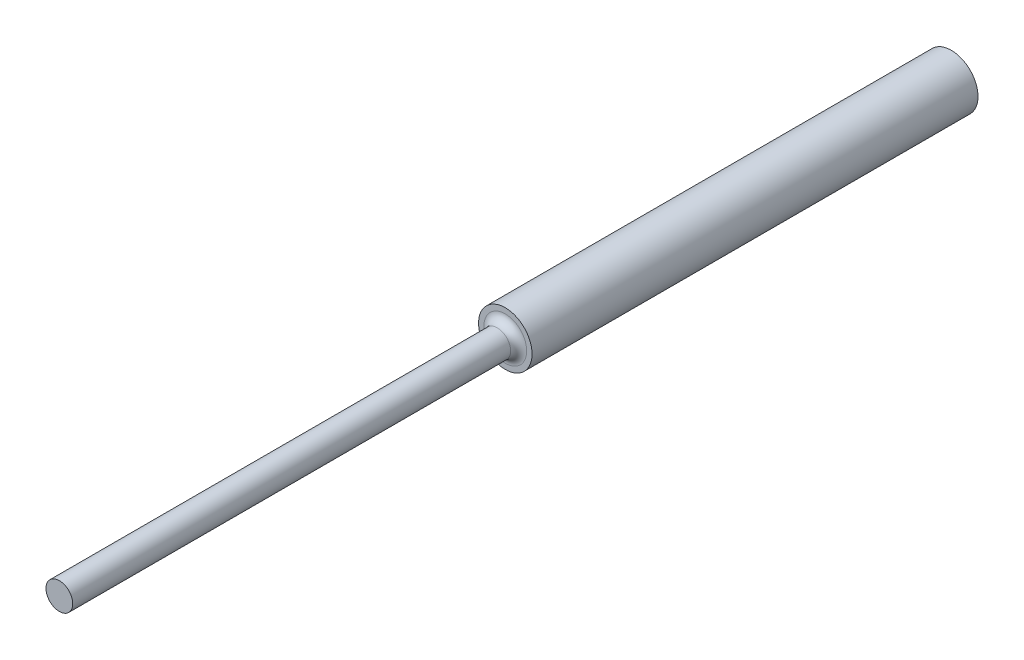
ISO-10303-21;
HEADER;
FILE_DESCRIPTION(('STEP AP214'),'2;1');
FILE_NAME('part.step','',(''),(''),'','','');
FILE_SCHEMA(('AUTOMOTIVE_DESIGN { 1 0 10303 214 1 1 1 1 }'));
ENDSEC;
DATA;
#1=APPLICATION_CONTEXT('core data for automotive mechanical design processes');
#2=APPLICATION_PROTOCOL_DEFINITION('international standard','automotive_design',2000,#1);
#3=PRODUCT_CONTEXT('',#1,'mechanical');
#4=PRODUCT('Part','Part','',(#3));
#5=PRODUCT_RELATED_PRODUCT_CATEGORY('part','',(#4));
#6=PRODUCT_DEFINITION_FORMATION('','',#4);
#7=PRODUCT_DEFINITION_CONTEXT('part definition',#1,'design');
#8=PRODUCT_DEFINITION('design','',#6,#7);
#9=PRODUCT_DEFINITION_SHAPE('','',#8);
#10=(LENGTH_UNIT() NAMED_UNIT(*) SI_UNIT(.MILLI.,.METRE.));
#11=(NAMED_UNIT(*) PLANE_ANGLE_UNIT() SI_UNIT($,.RADIAN.));
#12=(NAMED_UNIT(*) SI_UNIT($,.STERADIAN.) SOLID_ANGLE_UNIT());
#13=UNCERTAINTY_MEASURE_WITH_UNIT(LENGTH_MEASURE(1.E-05),#10,'distance_accuracy_value','');
#14=(GEOMETRIC_REPRESENTATION_CONTEXT(3) GLOBAL_UNCERTAINTY_ASSIGNED_CONTEXT((#13)) GLOBAL_UNIT_ASSIGNED_CONTEXT((#10,
#11,#12)) REPRESENTATION_CONTEXT('',''));
#15=CARTESIAN_POINT('',(0.,0.,0.));
#16=DIRECTION('',(0.,0.,1.));
#17=DIRECTION('',(1.,0.,0.));
#18=AXIS2_PLACEMENT_3D('',#15,#16,#17);
#19=CARTESIAN_POINT('',(0.,0.,500.));
#20=DIRECTION('',(0.,0.,-1.));
#21=DIRECTION('',(-1.,0.,0.));
#22=AXIS2_PLACEMENT_3D('',#19,#20,#21);
#23=CYLINDRICAL_SURFACE('',#22,30.);
#24=CARTESIAN_POINT('',(0.,0.,500.));
#25=DIRECTION('',(0.,0.,1.));
#26=DIRECTION('',(1.,0.,0.));
#27=AXIS2_PLACEMENT_3D('',#24,#25,#26);
#28=CIRCLE('',#27,30.);
#29=CARTESIAN_POINT('',(30.,0.,500.));
#30=VERTEX_POINT('',#29);
#31=EDGE_CURVE('E56',#30,#30,#28,.T.);
#32=ORIENTED_EDGE('',*,*,#31,.F.);
#33=EDGE_LOOP('',(#32));
#34=FACE_BOUND('',#33,.T.);
#35=CARTESIAN_POINT('',(0.,0.,0.));
#36=DIRECTION('',(0.,0.,1.));
#37=DIRECTION('',(1.,0.,0.));
#38=AXIS2_PLACEMENT_3D('',#35,#36,#37);
#39=CIRCLE('',#38,30.);
#40=CARTESIAN_POINT('',(30.,0.,0.));
#41=VERTEX_POINT('',#40);
#42=EDGE_CURVE('E61',#41,#41,#39,.T.);
#43=ORIENTED_EDGE('',*,*,#42,.T.);
#44=EDGE_LOOP('',(#43));
#45=FACE_BOUND('',#44,.T.);
#46=ADVANCED_FACE('F43',(#34,#45),#23,.T.);
#47=CARTESIAN_POINT('',(0.,0.,500.));
#48=DIRECTION('',(0.,0.,1.));
#49=DIRECTION('',(1.,0.,0.));
#50=AXIS2_PLACEMENT_3D('',#47,#48,#49);
#51=PLANE('',#50);
#52=CARTESIAN_POINT('',(0.,0.,500.));
#53=DIRECTION('',(0.,0.,1.));
#54=DIRECTION('',(1.,0.,0.));
#55=AXIS2_PLACEMENT_3D('',#52,#53,#54);
#56=CIRCLE('',#55,24.);
#57=CARTESIAN_POINT('',(24.,0.,500.));
#58=VERTEX_POINT('',#57);
#59=EDGE_CURVE('E10',#58,#58,#56,.F.);
#60=ORIENTED_EDGE('',*,*,#59,.T.);
#61=EDGE_LOOP('',(#60));
#62=FACE_BOUND('',#61,.T.);
#63=ORIENTED_EDGE('',*,*,#31,.T.);
#64=EDGE_LOOP('',(#63));
#65=FACE_BOUND('',#64,.T.);
#66=ADVANCED_FACE('F83',(#62,#65),#51,.T.);
#67=CARTESIAN_POINT('',(0.,0.,0.));
#68=DIRECTION('',(0.,0.,1.));
#69=DIRECTION('',(1.,0.,0.));
#70=AXIS2_PLACEMENT_3D('',#67,#68,#69);
#71=PLANE('',#70);
#72=ORIENTED_EDGE('',*,*,#42,.F.);
#73=EDGE_LOOP('',(#72));
#74=FACE_BOUND('',#73,.T.);
#75=ADVANCED_FACE('F76',(#74),#71,.F.);
#76=CARTESIAN_POINT('',(0.,0.,1000.));
#77=DIRECTION('',(0.,0.,-1.));
#78=DIRECTION('',(-1.,0.,0.));
#79=AXIS2_PLACEMENT_3D('',#76,#77,#78);
#80=CYLINDRICAL_SURFACE('',#79,15.);
#81=CARTESIAN_POINT('',(0.,0.,509.));
#82=DIRECTION('',(0.,0.,1.));
#83=DIRECTION('',(1.,0.,0.));
#84=AXIS2_PLACEMENT_3D('',#81,#82,#83);
#85=CIRCLE('',#84,15.);
#86=CARTESIAN_POINT('',(15.,0.,509.));
#87=VERTEX_POINT('',#86);
#88=EDGE_CURVE('E51',#87,#87,#85,.T.);
#89=ORIENTED_EDGE('',*,*,#88,.T.);
#90=EDGE_LOOP('',(#89));
#91=FACE_BOUND('',#90,.T.);
#92=CARTESIAN_POINT('',(0.,0.,1000.));
#93=DIRECTION('',(0.,0.,1.));
#94=DIRECTION('',(1.,0.,0.));
#95=AXIS2_PLACEMENT_3D('',#92,#93,#94);
#96=CIRCLE('',#95,15.);
#97=CARTESIAN_POINT('',(15.,0.,1000.));
#98=VERTEX_POINT('',#97);
#99=EDGE_CURVE('E66',#98,#98,#96,.T.);
#100=ORIENTED_EDGE('',*,*,#99,.F.);
#101=EDGE_LOOP('',(#100));
#102=FACE_BOUND('',#101,.T.);
#103=ADVANCED_FACE('F74',(#91,#102),#80,.T.);
#104=CARTESIAN_POINT('',(0.,0.,1000.));
#105=DIRECTION('',(0.,0.,1.));
#106=DIRECTION('',(1.,0.,0.));
#107=AXIS2_PLACEMENT_3D('',#104,#105,#106);
#108=PLANE('',#107);
#109=ORIENTED_EDGE('',*,*,#99,.T.);
#110=EDGE_LOOP('',(#109));
#111=FACE_BOUND('',#110,.T.);
#112=ADVANCED_FACE('F72',(#111),#108,.T.);
#113=CARTESIAN_POINT('',(0.,0.,509.));
#114=DIRECTION('',(0.,0.,1.));
#115=DIRECTION('',(1.,0.,0.));
#116=AXIS2_PLACEMENT_3D('',#113,#114,#115);
#117=TOROIDAL_SURFACE('',#116,24.,9.);
#118=ORIENTED_EDGE('',*,*,#59,.F.);
#119=EDGE_LOOP('',(#118));
#120=FACE_BOUND('',#119,.T.);
#121=ORIENTED_EDGE('',*,*,#88,.F.);
#122=EDGE_LOOP('',(#121));
#123=FACE_BOUND('',#122,.T.);
#124=ADVANCED_FACE('F45',(#120,#123),#117,.F.);
#125=CLOSED_SHELL('',(#46,#66,#75,#103,#112,#124));
#126=MANIFOLD_SOLID_BREP('B2',#125);
#127=ADVANCED_BREP_SHAPE_REPRESENTATION('',(#18,#126),#14);
#128=SHAPE_DEFINITION_REPRESENTATION(#9,#127);
ENDSEC;
END-ISO-10303-21;
